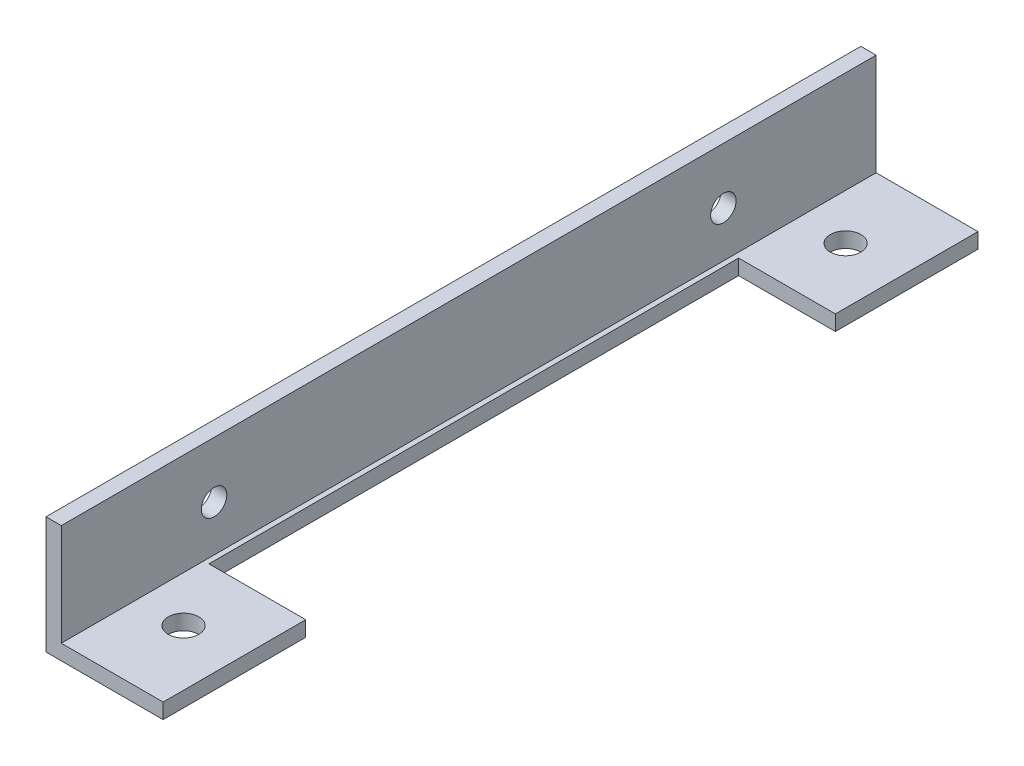
ISO-10303-21;
HEADER;
FILE_DESCRIPTION(('STEP AP214'),'2;1');
FILE_NAME('part.step','',(''),(''),'','','');
FILE_SCHEMA(('AUTOMOTIVE_DESIGN { 1 0 10303 214 1 1 1 1 }'));
ENDSEC;
DATA;
#1=APPLICATION_CONTEXT('core data for automotive mechanical design processes');
#2=APPLICATION_PROTOCOL_DEFINITION('international standard','automotive_design',2000,#1);
#3=PRODUCT_CONTEXT('',#1,'mechanical');
#4=PRODUCT('Part','Part','',(#3));
#5=PRODUCT_RELATED_PRODUCT_CATEGORY('part','',(#4));
#6=PRODUCT_DEFINITION_FORMATION('','',#4);
#7=PRODUCT_DEFINITION_CONTEXT('part definition',#1,'design');
#8=PRODUCT_DEFINITION('design','',#6,#7);
#9=PRODUCT_DEFINITION_SHAPE('','',#8);
#10=(LENGTH_UNIT() NAMED_UNIT(*) SI_UNIT(.MILLI.,.METRE.));
#11=(NAMED_UNIT(*) PLANE_ANGLE_UNIT() SI_UNIT($,.RADIAN.));
#12=(NAMED_UNIT(*) SI_UNIT($,.STERADIAN.) SOLID_ANGLE_UNIT());
#13=UNCERTAINTY_MEASURE_WITH_UNIT(LENGTH_MEASURE(1.E-05),#10,'distance_accuracy_value','');
#14=(GEOMETRIC_REPRESENTATION_CONTEXT(3) GLOBAL_UNCERTAINTY_ASSIGNED_CONTEXT((#13)) GLOBAL_UNIT_ASSIGNED_CONTEXT((#10,
#11,#12)) REPRESENTATION_CONTEXT('',''));
#15=CARTESIAN_POINT('',(0.,0.,0.));
#16=DIRECTION('',(0.,0.,1.));
#17=DIRECTION('',(1.,0.,0.));
#18=AXIS2_PLACEMENT_3D('',#15,#16,#17);
#19=CARTESIAN_POINT('',(11.5,1.5,80.));
#20=DIRECTION('',(1.,0.,0.));
#21=DIRECTION('',(0.,0.,-1.));
#22=AXIS2_PLACEMENT_3D('',#19,#20,#21);
#23=PLANE('',#22);
#24=DIRECTION('',(0.,-1.,0.));
#25=VECTOR('',#24,1.);
#26=CARTESIAN_POINT('',(11.5,10.,14.));
#27=LINE('',#26,#25);
#28=CARTESIAN_POINT('',(11.5,1.5,14.));
#29=VERTEX_POINT('',#28);
#30=CARTESIAN_POINT('',(11.5,0.,14.));
#31=VERTEX_POINT('',#30);
#32=EDGE_CURVE('E198',#29,#31,#27,.T.);
#33=ORIENTED_EDGE('',*,*,#32,.T.);
#34=DIRECTION('',(0.,0.,-1.));
#35=VECTOR('',#34,1.);
#36=CARTESIAN_POINT('',(11.5,0.,80.));
#37=LINE('',#36,#35);
#38=CARTESIAN_POINT('',(11.5,0.,0.));
#39=VERTEX_POINT('',#38);
#40=EDGE_CURVE('E151',#31,#39,#37,.T.);
#41=ORIENTED_EDGE('',*,*,#40,.T.);
#42=DIRECTION('',(0.,-1.,0.));
#43=VECTOR('',#42,1.);
#44=CARTESIAN_POINT('',(11.5,1.5,0.));
#45=LINE('',#44,#43);
#46=CARTESIAN_POINT('',(11.5,1.5,0.));
#47=VERTEX_POINT('',#46);
#48=EDGE_CURVE('E133',#47,#39,#45,.T.);
#49=ORIENTED_EDGE('',*,*,#48,.F.);
#50=DIRECTION('',(0.,0.,-1.));
#51=VECTOR('',#50,1.);
#52=CARTESIAN_POINT('',(11.5,1.5,80.));
#53=LINE('',#52,#51);
#54=EDGE_CURVE('E147',#29,#47,#53,.T.);
#55=ORIENTED_EDGE('',*,*,#54,.F.);
#56=EDGE_LOOP('',(#33,#41,#49,#55));
#57=FACE_BOUND('',#56,.T.);
#58=ADVANCED_FACE('F34',(#57),#23,.T.);
#59=CARTESIAN_POINT('',(0.,0.,80.));
#60=DIRECTION('',(0.,1.,0.));
#61=DIRECTION('',(0.,0.,1.));
#62=AXIS2_PLACEMENT_3D('',#59,#60,#61);
#63=PLANE('',#62);
#64=CARTESIAN_POINT('',(6.00000000000001,0.,72.5));
#65=DIRECTION('',(0.,-1.,0.));
#66=DIRECTION('',(0.,0.,1.));
#67=AXIS2_PLACEMENT_3D('',#64,#65,#66);
#68=CIRCLE('',#67,1.5);
#69=CARTESIAN_POINT('',(6.00000000000001,0.,74.));
#70=VERTEX_POINT('',#69);
#71=EDGE_CURVE('E255',#70,#70,#68,.T.);
#72=ORIENTED_EDGE('',*,*,#71,.F.);
#73=EDGE_LOOP('',(#72));
#74=FACE_BOUND('',#73,.T.);
#75=CARTESIAN_POINT('',(6.00000000000001,0.,7.5));
#76=DIRECTION('',(0.,-1.,0.));
#77=DIRECTION('',(0.,0.,-1.));
#78=AXIS2_PLACEMENT_3D('',#75,#76,#77);
#79=CIRCLE('',#78,1.5);
#80=CARTESIAN_POINT('',(6.00000000000001,0.,6.));
#81=VERTEX_POINT('',#80);
#82=EDGE_CURVE('E160',#81,#81,#79,.T.);
#83=ORIENTED_EDGE('',*,*,#82,.F.);
#84=EDGE_LOOP('',(#83));
#85=FACE_BOUND('',#84,.T.);
#86=ORIENTED_EDGE('',*,*,#40,.F.);
#87=DIRECTION('',(1.,0.,0.));
#88=VECTOR('',#87,1.);
#89=CARTESIAN_POINT('',(2.00000000000001,0.,14.));
#90=LINE('',#89,#88);
#91=CARTESIAN_POINT('',(2.00000000000001,0.,14.));
#92=VERTEX_POINT('',#91);
#93=EDGE_CURVE('E188',#92,#31,#90,.T.);
#94=ORIENTED_EDGE('',*,*,#93,.F.);
#95=DIRECTION('',(0.,0.,-1.));
#96=VECTOR('',#95,1.);
#97=CARTESIAN_POINT('',(2.00000000000001,0.,66.));
#98=LINE('',#97,#96);
#99=CARTESIAN_POINT('',(2.00000000000001,0.,66.));
#100=VERTEX_POINT('',#99);
#101=EDGE_CURVE('E192',#100,#92,#98,.T.);
#102=ORIENTED_EDGE('',*,*,#101,.F.);
#103=DIRECTION('',(-1.,0.,0.));
#104=VECTOR('',#103,1.);
#105=CARTESIAN_POINT('',(2.00000000000001,0.,66.));
#106=LINE('',#105,#104);
#107=CARTESIAN_POINT('',(11.5,0.,66.));
#108=VERTEX_POINT('',#107);
#109=EDGE_CURVE('E254',#108,#100,#106,.T.);
#110=ORIENTED_EDGE('',*,*,#109,.F.);
#111=CARTESIAN_POINT('',(11.5,0.,80.));
#112=VERTEX_POINT('',#111);
#113=EDGE_CURVE('E152',#112,#108,#37,.T.);
#114=ORIENTED_EDGE('',*,*,#113,.F.);
#115=DIRECTION('',(1.,0.,0.));
#116=VECTOR('',#115,1.);
#117=CARTESIAN_POINT('',(0.,0.,80.));
#118=LINE('',#117,#116);
#119=CARTESIAN_POINT('',(0.,0.,80.));
#120=VERTEX_POINT('',#119);
#121=EDGE_CURVE('E92',#120,#112,#118,.T.);
#122=ORIENTED_EDGE('',*,*,#121,.F.);
#123=DIRECTION('',(0.,0.,-1.));
#124=VECTOR('',#123,1.);
#125=CARTESIAN_POINT('',(0.,0.,80.));
#126=LINE('',#125,#124);
#127=CARTESIAN_POINT('',(0.,0.,0.));
#128=VERTEX_POINT('',#127);
#129=EDGE_CURVE('E126',#120,#128,#126,.T.);
#130=ORIENTED_EDGE('',*,*,#129,.T.);
#131=DIRECTION('',(1.,0.,0.));
#132=VECTOR('',#131,1.);
#133=CARTESIAN_POINT('',(0.,0.,0.));
#134=LINE('',#133,#132);
#135=EDGE_CURVE('E130',#128,#39,#134,.T.);
#136=ORIENTED_EDGE('',*,*,#135,.T.);
#137=EDGE_LOOP('',(#86,#94,#102,#110,#114,#122,#130,#136));
#138=FACE_BOUND('',#137,.T.);
#139=ADVANCED_FACE('F36',(#74,#85,#138),#63,.F.);
#140=DIRECTION('',(0.,-1.,0.));
#141=VECTOR('',#140,1.);
#142=CARTESIAN_POINT('',(11.5,10.,66.));
#143=LINE('',#142,#141);
#144=CARTESIAN_POINT('',(11.5,1.5,66.));
#145=VERTEX_POINT('',#144);
#146=EDGE_CURVE('E181',#145,#108,#143,.T.);
#147=ORIENTED_EDGE('',*,*,#146,.F.);
#148=CARTESIAN_POINT('',(11.5,1.5,80.));
#149=VERTEX_POINT('',#148);
#150=EDGE_CURVE('E148',#149,#145,#53,.T.);
#151=ORIENTED_EDGE('',*,*,#150,.F.);
#152=DIRECTION('',(0.,-1.,0.));
#153=VECTOR('',#152,1.);
#154=CARTESIAN_POINT('',(11.5,1.5,80.));
#155=LINE('',#154,#153);
#156=EDGE_CURVE('E210',#149,#112,#155,.T.);
#157=ORIENTED_EDGE('',*,*,#156,.T.);
#158=ORIENTED_EDGE('',*,*,#113,.T.);
#159=EDGE_LOOP('',(#147,#151,#157,#158));
#160=FACE_BOUND('',#159,.T.);
#161=ADVANCED_FACE('F186',(#160),#23,.T.);
#162=CARTESIAN_POINT('',(0.,1.5,80.));
#163=DIRECTION('',(0.,1.,0.));
#164=DIRECTION('',(0.,0.,1.));
#165=AXIS2_PLACEMENT_3D('',#162,#163,#164);
#166=PLANE('',#165);
#167=CARTESIAN_POINT('',(6.00000000000001,1.5,72.5));
#168=DIRECTION('',(0.,1.,0.));
#169=DIRECTION('',(0.,0.,1.));
#170=AXIS2_PLACEMENT_3D('',#167,#168,#169);
#171=CIRCLE('',#170,1.5);
#172=CARTESIAN_POINT('',(6.00000000000001,1.5,74.));
#173=VERTEX_POINT('',#172);
#174=EDGE_CURVE('E38',#173,#173,#171,.T.);
#175=ORIENTED_EDGE('',*,*,#174,.F.);
#176=EDGE_LOOP('',(#175));
#177=FACE_BOUND('',#176,.T.);
#178=DIRECTION('',(-1.,0.,0.));
#179=VECTOR('',#178,1.);
#180=CARTESIAN_POINT('',(0.,1.5,14.));
#181=LINE('',#180,#179);
#182=CARTESIAN_POINT('',(2.00000000000001,1.5,14.));
#183=VERTEX_POINT('',#182);
#184=EDGE_CURVE('E11',#29,#183,#181,.T.);
#185=ORIENTED_EDGE('',*,*,#184,.F.);
#186=ORIENTED_EDGE('',*,*,#54,.T.);
#187=DIRECTION('',(1.,0.,0.));
#188=VECTOR('',#187,1.);
#189=CARTESIAN_POINT('',(0.,1.5,0.));
#190=LINE('',#189,#188);
#191=CARTESIAN_POINT('',(1.5,1.5,0.));
#192=VERTEX_POINT('',#191);
#193=EDGE_CURVE('E137',#192,#47,#190,.T.);
#194=ORIENTED_EDGE('',*,*,#193,.F.);
#195=DIRECTION('',(0.,0.,-1.));
#196=VECTOR('',#195,1.);
#197=CARTESIAN_POINT('',(1.5,1.5,80.));
#198=LINE('',#197,#196);
#199=CARTESIAN_POINT('',(1.5,1.5,80.));
#200=VERTEX_POINT('',#199);
#201=EDGE_CURVE('E115',#200,#192,#198,.T.);
#202=ORIENTED_EDGE('',*,*,#201,.F.);
#203=DIRECTION('',(1.,0.,0.));
#204=VECTOR('',#203,1.);
#205=CARTESIAN_POINT('',(0.,1.5,80.));
#206=LINE('',#205,#204);
#207=EDGE_CURVE('E122',#200,#149,#206,.T.);
#208=ORIENTED_EDGE('',*,*,#207,.T.);
#209=ORIENTED_EDGE('',*,*,#150,.T.);
#210=DIRECTION('',(1.,0.,0.));
#211=VECTOR('',#210,1.);
#212=CARTESIAN_POINT('',(0.,1.5,66.));
#213=LINE('',#212,#211);
#214=CARTESIAN_POINT('',(2.00000000000001,1.5,66.));
#215=VERTEX_POINT('',#214);
#216=EDGE_CURVE('E155',#215,#145,#213,.T.);
#217=ORIENTED_EDGE('',*,*,#216,.F.);
#218=DIRECTION('',(0.,0.,1.));
#219=VECTOR('',#218,1.);
#220=CARTESIAN_POINT('',(2.00000000000001,1.5,80.));
#221=LINE('',#220,#219);
#222=EDGE_CURVE('E43',#183,#215,#221,.T.);
#223=ORIENTED_EDGE('',*,*,#222,.F.);
#224=EDGE_LOOP('',(#185,#186,#194,#202,#208,#209,#217,#223));
#225=FACE_BOUND('',#224,.T.);
#226=CARTESIAN_POINT('',(6.00000000000001,1.5,7.5));
#227=DIRECTION('',(0.,1.,0.));
#228=DIRECTION('',(0.,0.,1.));
#229=AXIS2_PLACEMENT_3D('',#226,#227,#228);
#230=CIRCLE('',#229,1.5);
#231=CARTESIAN_POINT('',(6.00000000000001,1.5,9.));
#232=VERTEX_POINT('',#231);
#233=EDGE_CURVE('E156',#232,#232,#230,.T.);
#234=ORIENTED_EDGE('',*,*,#233,.F.);
#235=EDGE_LOOP('',(#234));
#236=FACE_BOUND('',#235,.T.);
#237=ADVANCED_FACE('F174',(#177,#225,#236),#166,.T.);
#238=CARTESIAN_POINT('',(1.5,11.5,80.));
#239=DIRECTION('',(1.,0.,0.));
#240=DIRECTION('',(0.,1.,0.));
#241=AXIS2_PLACEMENT_3D('',#238,#239,#240);
#242=PLANE('',#241);
#243=CARTESIAN_POINT('',(1.5,5.99999999999999,65.));
#244=DIRECTION('',(1.,0.,0.));
#245=DIRECTION('',(0.,1.,0.));
#246=AXIS2_PLACEMENT_3D('',#243,#244,#245);
#247=CIRCLE('',#246,1.25);
#248=CARTESIAN_POINT('',(1.5,7.24999999999999,65.));
#249=VERTEX_POINT('',#248);
#250=EDGE_CURVE('E201',#249,#249,#247,.T.);
#251=ORIENTED_EDGE('',*,*,#250,.F.);
#252=EDGE_LOOP('',(#251));
#253=FACE_BOUND('',#252,.T.);
#254=CARTESIAN_POINT('',(1.5,5.99999999999999,15.));
#255=DIRECTION('',(1.,0.,0.));
#256=DIRECTION('',(0.,1.,0.));
#257=AXIS2_PLACEMENT_3D('',#254,#255,#256);
#258=CIRCLE('',#257,1.25);
#259=CARTESIAN_POINT('',(1.5,7.24999999999999,15.));
#260=VERTEX_POINT('',#259);
#261=EDGE_CURVE('E134',#260,#260,#258,.T.);
#262=ORIENTED_EDGE('',*,*,#261,.F.);
#263=EDGE_LOOP('',(#262));
#264=FACE_BOUND('',#263,.T.);
#265=DIRECTION('',(0.,-1.,0.));
#266=VECTOR('',#265,1.);
#267=CARTESIAN_POINT('',(1.5,11.5,0.));
#268=LINE('',#267,#266);
#269=CARTESIAN_POINT('',(1.5,11.5,0.));
#270=VERTEX_POINT('',#269);
#271=EDGE_CURVE('E110',#270,#192,#268,.T.);
#272=ORIENTED_EDGE('',*,*,#271,.F.);
#273=DIRECTION('',(0.,0.,-1.));
#274=VECTOR('',#273,1.);
#275=CARTESIAN_POINT('',(1.5,11.5,80.));
#276=LINE('',#275,#274);
#277=CARTESIAN_POINT('',(1.5,11.5,80.));
#278=VERTEX_POINT('',#277);
#279=EDGE_CURVE('E105',#278,#270,#276,.T.);
#280=ORIENTED_EDGE('',*,*,#279,.F.);
#281=DIRECTION('',(0.,-1.,0.));
#282=VECTOR('',#281,1.);
#283=CARTESIAN_POINT('',(1.5,11.5,80.));
#284=LINE('',#283,#282);
#285=EDGE_CURVE('E108',#278,#200,#284,.T.);
#286=ORIENTED_EDGE('',*,*,#285,.T.);
#287=ORIENTED_EDGE('',*,*,#201,.T.);
#288=EDGE_LOOP('',(#272,#280,#286,#287));
#289=FACE_BOUND('',#288,.T.);
#290=ADVANCED_FACE('F107',(#253,#264,#289),#242,.T.);
#291=CARTESIAN_POINT('',(0.,11.5,80.));
#292=DIRECTION('',(0.,1.,0.));
#293=DIRECTION('',(0.,0.,1.));
#294=AXIS2_PLACEMENT_3D('',#291,#292,#293);
#295=PLANE('',#294);
#296=DIRECTION('',(1.,0.,0.));
#297=VECTOR('',#296,1.);
#298=CARTESIAN_POINT('',(0.,11.5,0.));
#299=LINE('',#298,#297);
#300=CARTESIAN_POINT('',(0.,11.5,0.));
#301=VERTEX_POINT('',#300);
#302=EDGE_CURVE('E141',#301,#270,#299,.T.);
#303=ORIENTED_EDGE('',*,*,#302,.F.);
#304=DIRECTION('',(0.,0.,-1.));
#305=VECTOR('',#304,1.);
#306=CARTESIAN_POINT('',(0.,11.5,80.));
#307=LINE('',#306,#305);
#308=CARTESIAN_POINT('',(0.,11.5,80.));
#309=VERTEX_POINT('',#308);
#310=EDGE_CURVE('E116',#309,#301,#307,.T.);
#311=ORIENTED_EDGE('',*,*,#310,.F.);
#312=DIRECTION('',(1.,0.,0.));
#313=VECTOR('',#312,1.);
#314=CARTESIAN_POINT('',(0.,11.5,80.));
#315=LINE('',#314,#313);
#316=EDGE_CURVE('E120',#309,#278,#315,.T.);
#317=ORIENTED_EDGE('',*,*,#316,.T.);
#318=ORIENTED_EDGE('',*,*,#279,.T.);
#319=EDGE_LOOP('',(#303,#311,#317,#318));
#320=FACE_BOUND('',#319,.T.);
#321=ADVANCED_FACE('F124',(#320),#295,.T.);
#322=CARTESIAN_POINT('',(0.,11.5,80.));
#323=DIRECTION('',(1.,0.,0.));
#324=DIRECTION('',(0.,1.,0.));
#325=AXIS2_PLACEMENT_3D('',#322,#323,#324);
#326=PLANE('',#325);
#327=CARTESIAN_POINT('',(0.,5.99999999999999,65.));
#328=DIRECTION('',(-1.,0.,0.));
#329=DIRECTION('',(0.,1.,0.));
#330=AXIS2_PLACEMENT_3D('',#327,#328,#329);
#331=CIRCLE('',#330,1.25);
#332=CARTESIAN_POINT('',(0.,7.24999999999999,65.));
#333=VERTEX_POINT('',#332);
#334=EDGE_CURVE('E159',#333,#333,#331,.T.);
#335=ORIENTED_EDGE('',*,*,#334,.F.);
#336=EDGE_LOOP('',(#335));
#337=FACE_BOUND('',#336,.T.);
#338=CARTESIAN_POINT('',(0.,5.99999999999999,15.));
#339=DIRECTION('',(-1.,0.,0.));
#340=DIRECTION('',(0.,-1.,0.));
#341=AXIS2_PLACEMENT_3D('',#338,#339,#340);
#342=CIRCLE('',#341,1.25);
#343=CARTESIAN_POINT('',(0.,4.74999999999999,15.));
#344=VERTEX_POINT('',#343);
#345=EDGE_CURVE('E204',#344,#344,#342,.T.);
#346=ORIENTED_EDGE('',*,*,#345,.F.);
#347=EDGE_LOOP('',(#346));
#348=FACE_BOUND('',#347,.T.);
#349=DIRECTION('',(0.,-1.,0.));
#350=VECTOR('',#349,1.);
#351=CARTESIAN_POINT('',(0.,11.5,0.));
#352=LINE('',#351,#350);
#353=EDGE_CURVE('E86',#301,#128,#352,.T.);
#354=ORIENTED_EDGE('',*,*,#353,.T.);
#355=ORIENTED_EDGE('',*,*,#129,.F.);
#356=DIRECTION('',(0.,-1.,0.));
#357=VECTOR('',#356,1.);
#358=CARTESIAN_POINT('',(0.,11.5,80.));
#359=LINE('',#358,#357);
#360=EDGE_CURVE('E59',#309,#120,#359,.T.);
#361=ORIENTED_EDGE('',*,*,#360,.F.);
#362=ORIENTED_EDGE('',*,*,#310,.T.);
#363=EDGE_LOOP('',(#354,#355,#361,#362));
#364=FACE_BOUND('',#363,.T.);
#365=ADVANCED_FACE('F220',(#337,#348,#364),#326,.F.);
#366=CARTESIAN_POINT('',(0.,0.,80.));
#367=DIRECTION('',(0.,0.,-1.));
#368=DIRECTION('',(-1.,0.,0.));
#369=AXIS2_PLACEMENT_3D('',#366,#367,#368);
#370=PLANE('',#369);
#371=ORIENTED_EDGE('',*,*,#121,.T.);
#372=ORIENTED_EDGE('',*,*,#156,.F.);
#373=ORIENTED_EDGE('',*,*,#207,.F.);
#374=ORIENTED_EDGE('',*,*,#285,.F.);
#375=ORIENTED_EDGE('',*,*,#316,.F.);
#376=ORIENTED_EDGE('',*,*,#360,.T.);
#377=EDGE_LOOP('',(#371,#372,#373,#374,#375,#376));
#378=FACE_BOUND('',#377,.T.);
#379=ADVANCED_FACE('F119',(#378),#370,.F.);
#380=CARTESIAN_POINT('',(0.,0.,0.));
#381=DIRECTION('',(0.,0.,-1.));
#382=DIRECTION('',(-1.,0.,0.));
#383=AXIS2_PLACEMENT_3D('',#380,#381,#382);
#384=PLANE('',#383);
#385=ORIENTED_EDGE('',*,*,#135,.F.);
#386=ORIENTED_EDGE('',*,*,#353,.F.);
#387=ORIENTED_EDGE('',*,*,#302,.T.);
#388=ORIENTED_EDGE('',*,*,#271,.T.);
#389=ORIENTED_EDGE('',*,*,#193,.T.);
#390=ORIENTED_EDGE('',*,*,#48,.T.);
#391=EDGE_LOOP('',(#385,#386,#387,#388,#389,#390));
#392=FACE_BOUND('',#391,.T.);
#393=ADVANCED_FACE('F216',(#392),#384,.T.);
#394=CARTESIAN_POINT('',(10.,5.99999999999999,15.));
#395=DIRECTION('',(-1.,0.,0.));
#396=DIRECTION('',(0.,-1.,0.));
#397=AXIS2_PLACEMENT_3D('',#394,#395,#396);
#398=CYLINDRICAL_SURFACE('',#397,1.25);
#399=ORIENTED_EDGE('',*,*,#261,.T.);
#400=EDGE_LOOP('',(#399));
#401=FACE_BOUND('',#400,.T.);
#402=ORIENTED_EDGE('',*,*,#345,.T.);
#403=EDGE_LOOP('',(#402));
#404=FACE_BOUND('',#403,.T.);
#405=ADVANCED_FACE('F290',(#401,#404),#398,.F.);
#406=CARTESIAN_POINT('',(10.,5.99999999999999,65.));
#407=DIRECTION('',(-1.,0.,0.));
#408=DIRECTION('',(0.,-1.,0.));
#409=AXIS2_PLACEMENT_3D('',#406,#407,#408);
#410=CYLINDRICAL_SURFACE('',#409,1.25);
#411=ORIENTED_EDGE('',*,*,#250,.T.);
#412=EDGE_LOOP('',(#411));
#413=FACE_BOUND('',#412,.T.);
#414=ORIENTED_EDGE('',*,*,#334,.T.);
#415=EDGE_LOOP('',(#414));
#416=FACE_BOUND('',#415,.T.);
#417=ADVANCED_FACE('F280',(#413,#416),#410,.F.);
#418=CARTESIAN_POINT('',(6.00000000000001,10.,7.5));
#419=DIRECTION('',(0.,-1.,0.));
#420=DIRECTION('',(0.,0.,-1.));
#421=AXIS2_PLACEMENT_3D('',#418,#419,#420);
#422=CYLINDRICAL_SURFACE('',#421,1.5);
#423=ORIENTED_EDGE('',*,*,#233,.T.);
#424=EDGE_LOOP('',(#423));
#425=FACE_BOUND('',#424,.T.);
#426=ORIENTED_EDGE('',*,*,#82,.T.);
#427=EDGE_LOOP('',(#426));
#428=FACE_BOUND('',#427,.T.);
#429=ADVANCED_FACE('F273',(#425,#428),#422,.F.);
#430=CARTESIAN_POINT('',(2.00000000000001,10.,14.));
#431=DIRECTION('',(0.,0.,-1.));
#432=DIRECTION('',(-1.,0.,0.));
#433=AXIS2_PLACEMENT_3D('',#430,#431,#432);
#434=PLANE('',#433);
#435=ORIENTED_EDGE('',*,*,#184,.T.);
#436=DIRECTION('',(0.,-1.,0.));
#437=VECTOR('',#436,1.);
#438=CARTESIAN_POINT('',(2.00000000000001,10.,14.));
#439=LINE('',#438,#437);
#440=EDGE_CURVE('E171',#183,#92,#439,.T.);
#441=ORIENTED_EDGE('',*,*,#440,.T.);
#442=ORIENTED_EDGE('',*,*,#93,.T.);
#443=ORIENTED_EDGE('',*,*,#32,.F.);
#444=EDGE_LOOP('',(#435,#441,#442,#443));
#445=FACE_BOUND('',#444,.T.);
#446=ADVANCED_FACE('F265',(#445),#434,.F.);
#447=CARTESIAN_POINT('',(2.00000000000001,10.,66.));
#448=DIRECTION('',(-1.,0.,0.));
#449=DIRECTION('',(0.,0.,1.));
#450=AXIS2_PLACEMENT_3D('',#447,#448,#449);
#451=PLANE('',#450);
#452=ORIENTED_EDGE('',*,*,#222,.T.);
#453=DIRECTION('',(0.,-1.,0.));
#454=VECTOR('',#453,1.);
#455=CARTESIAN_POINT('',(2.00000000000001,10.,66.));
#456=LINE('',#455,#454);
#457=EDGE_CURVE('E50',#215,#100,#456,.T.);
#458=ORIENTED_EDGE('',*,*,#457,.T.);
#459=ORIENTED_EDGE('',*,*,#101,.T.);
#460=ORIENTED_EDGE('',*,*,#440,.F.);
#461=EDGE_LOOP('',(#452,#458,#459,#460));
#462=FACE_BOUND('',#461,.T.);
#463=ADVANCED_FACE('F166',(#462),#451,.F.);
#464=CARTESIAN_POINT('',(2.00000000000001,10.,66.));
#465=DIRECTION('',(0.,0.,1.));
#466=DIRECTION('',(1.,0.,0.));
#467=AXIS2_PLACEMENT_3D('',#464,#465,#466);
#468=PLANE('',#467);
#469=ORIENTED_EDGE('',*,*,#216,.T.);
#470=ORIENTED_EDGE('',*,*,#146,.T.);
#471=ORIENTED_EDGE('',*,*,#109,.T.);
#472=ORIENTED_EDGE('',*,*,#457,.F.);
#473=EDGE_LOOP('',(#469,#470,#471,#472));
#474=FACE_BOUND('',#473,.T.);
#475=ADVANCED_FACE('F179',(#474),#468,.F.);
#476=CARTESIAN_POINT('',(6.00000000000001,10.,72.5));
#477=DIRECTION('',(0.,-1.,0.));
#478=DIRECTION('',(0.,0.,-1.));
#479=AXIS2_PLACEMENT_3D('',#476,#477,#478);
#480=CYLINDRICAL_SURFACE('',#479,1.5);
#481=ORIENTED_EDGE('',*,*,#174,.T.);
#482=EDGE_LOOP('',(#481));
#483=FACE_BOUND('',#482,.T.);
#484=ORIENTED_EDGE('',*,*,#71,.T.);
#485=EDGE_LOOP('',(#484));
#486=FACE_BOUND('',#485,.T.);
#487=ADVANCED_FACE('F284',(#483,#486),#480,.F.);
#488=CLOSED_SHELL('',(#58,#139,#161,#237,#290,#321,#365,#379,#393,#405,#417,#429,#446,#463,#475,#487));
#489=MANIFOLD_SOLID_BREP('B2',#488);
#490=ADVANCED_BREP_SHAPE_REPRESENTATION('',(#18,#489),#14);
#491=SHAPE_DEFINITION_REPRESENTATION(#9,#490);
ENDSEC;
END-ISO-10303-21;
